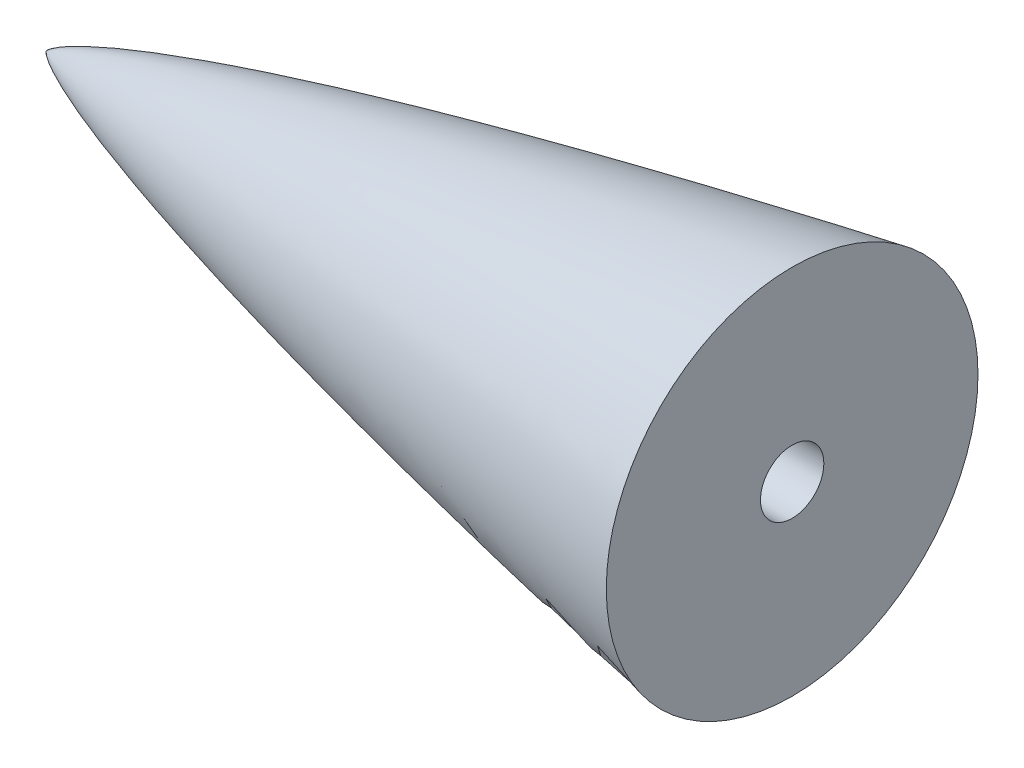
ISO-10303-21;
HEADER;
FILE_DESCRIPTION(('STEP AP214'),'2;1');
FILE_NAME('part.step','',(''),(''),'','','');
FILE_SCHEMA(('AUTOMOTIVE_DESIGN { 1 0 10303 214 1 1 1 1 }'));
ENDSEC;
DATA;
#1=APPLICATION_CONTEXT('core data for automotive mechanical design processes');
#2=APPLICATION_PROTOCOL_DEFINITION('international standard','automotive_design',2000,#1);
#3=PRODUCT_CONTEXT('',#1,'mechanical');
#4=PRODUCT('Part','Part','',(#3));
#5=PRODUCT_RELATED_PRODUCT_CATEGORY('part','',(#4));
#6=PRODUCT_DEFINITION_FORMATION('','',#4);
#7=PRODUCT_DEFINITION_CONTEXT('part definition',#1,'design');
#8=PRODUCT_DEFINITION('design','',#6,#7);
#9=PRODUCT_DEFINITION_SHAPE('','',#8);
#10=(LENGTH_UNIT() NAMED_UNIT(*) SI_UNIT(.MILLI.,.METRE.));
#11=(NAMED_UNIT(*) PLANE_ANGLE_UNIT() SI_UNIT($,.RADIAN.));
#12=(NAMED_UNIT(*) SI_UNIT($,.STERADIAN.) SOLID_ANGLE_UNIT());
#13=UNCERTAINTY_MEASURE_WITH_UNIT(LENGTH_MEASURE(1.E-05),#10,'distance_accuracy_value','');
#14=(GEOMETRIC_REPRESENTATION_CONTEXT(3) GLOBAL_UNCERTAINTY_ASSIGNED_CONTEXT((#13)) GLOBAL_UNIT_ASSIGNED_CONTEXT((#10,
#11,#12)) REPRESENTATION_CONTEXT('',''));
#15=CARTESIAN_POINT('',(0.,0.,0.));
#16=DIRECTION('',(0.,0.,1.));
#17=DIRECTION('',(1.,0.,0.));
#18=AXIS2_PLACEMENT_3D('',#15,#16,#17);
#19=CARTESIAN_POINT('',(80.,0.,0.));
#20=DIRECTION('',(1.,0.,0.));
#21=DIRECTION('',(0.,0.,-1.));
#22=AXIS2_PLACEMENT_3D('',#19,#20,#21);
#23=PLANE('',#22);
#24=CARTESIAN_POINT('',(80.,0.,0.));
#25=DIRECTION('',(1.,0.,0.));
#26=DIRECTION('',(0.,0.,-1.));
#27=AXIS2_PLACEMENT_3D('',#24,#25,#26);
#28=CIRCLE('',#27,3.4);
#29=CARTESIAN_POINT('',(80.,0.,-3.4));
#30=VERTEX_POINT('',#29);
#31=EDGE_CURVE('E79',#30,#30,#28,.T.);
#32=ORIENTED_EDGE('',*,*,#31,.F.);
#33=EDGE_LOOP('',(#32));
#34=FACE_BOUND('',#33,.T.);
#35=CARTESIAN_POINT('',(80.,0.,0.));
#36=DIRECTION('',(-1.,0.,0.));
#37=DIRECTION('',(0.,0.,1.));
#38=AXIS2_PLACEMENT_3D('',#35,#36,#37);
#39=CIRCLE('',#38,19.9360865732292);
#40=CARTESIAN_POINT('',(80.,0.,19.9360865732292));
#41=VERTEX_POINT('',#40);
#42=EDGE_CURVE('E12',#41,#41,#39,.F.);
#43=ORIENTED_EDGE('',*,*,#42,.T.);
#44=EDGE_LOOP('',(#43));
#45=FACE_BOUND('',#44,.T.);
#46=ADVANCED_FACE('F46',(#34,#45),#23,.T.);
#47=CARTESIAN_POINT('',(522.,64.,0.));
#48=CARTESIAN_POINT('',(521.590516942007,64.,0.));
#49=CARTESIAN_POINT('',(520.771561040287,63.9942688934299,0.));
#50=CARTESIAN_POINT('',(519.133691426009,63.9802670014868,0.));
#51=CARTESIAN_POINT('',(516.677010913587,63.9463939524722,0.));
#52=CARTESIAN_POINT('',(513.81106355721,63.8963781150164,0.));
#53=CARTESIAN_POINT('',(508.079596574187,63.7736937527318,0.));
#54=CARTESIAN_POINT('',(502.151121166139,63.6094457906622,0.));
#55=CARTESIAN_POINT('',(496.025715941466,63.409883926183,0.));
#56=CARTESIAN_POINT('',(489.703465178406,63.1762923349364,0.));
#57=CARTESIAN_POINT('',(485.63900431218,63.0166861878967,0.));
#58=CARTESIAN_POINT('',(480.558876848224,62.8060522017456,0.));
#59=CARTESIAN_POINT('',(474.463438705073,62.5365027866264,0.));
#60=CARTESIAN_POINT('',(467.353134193147,62.1993055640769,0.));
#61=CARTESIAN_POINT('',(459.228488268017,61.7852756732708,0.));
#62=CARTESIAN_POINT('',(449.074445036233,61.234348915932,0.));
#63=CARTESIAN_POINT('',(436.892399390841,60.5230064918632,0.));
#64=CARTESIAN_POINT('',(422.684094329235,59.6255360051907,0.));
#65=CARTESIAN_POINT('',(406.451649281317,58.5145436942091,0.));
#66=CARTESIAN_POINT('',(390.224875337688,57.3236348081094,0.));
#67=CARTESIAN_POINT('',(374.003843123209,56.0568670763544,0.));
#68=CARTESIAN_POINT('',(357.788673830139,54.717201132632,0.));
#69=CARTESIAN_POINT('',(337.527208668775,52.9542978334076,0.));
#70=CARTESIAN_POINT('',(313.225812894759,50.7004206895206,0.));
#71=CARTESIAN_POINT('',(284.893049860698,47.8733531730444,0.));
#72=CARTESIAN_POINT('',(252.541063500701,44.3705230861258,0.));
#73=CARTESIAN_POINT('',(220.220524829406,40.5877041843803,0.));
#74=CARTESIAN_POINT('',(187.93626848825,36.5067060471793,0.));
#75=CARTESIAN_POINT('',(155.694792913666,32.0989089346133,0.));
#76=CARTESIAN_POINT('',(123.506939436542,27.3147890527032,0.));
#77=CARTESIAN_POINT('',(91.3889285154668,22.077714796997,0.));
#78=CARTESIAN_POINT('',(62.8439543785186,16.872422149387,0.));
#79=CARTESIAN_POINT('',(39.4821084234338,12.0345623327772,0.));
#80=CARTESIAN_POINT('',(22.6082275835392,7.96176973354541,0.));
#81=CARTESIAN_POINT('',(12.8800296426853,5.24028530882847,0.));
#82=CARTESIAN_POINT('',(7.19313976770063,3.38812297662853,0.));
#83=CARTESIAN_POINT('',(4.12322816040121,2.23009214067667,0.));
#84=CARTESIAN_POINT('',(2.46511193855896,1.51464459715414,0.));
#85=CARTESIAN_POINT('',(1.534590026526,1.06017013162303,0.));
#86=CARTESIAN_POINT('',(0.982994633851909,0.758855245518446,0.));
#87=CARTESIAN_POINT('',(0.660423816631462,0.562634850320563,0.));
#88=CARTESIAN_POINT('',(0.460446691137349,0.428551795033052,0.));
#89=CARTESIAN_POINT('',(0.333600700303157,0.33590032232443,0.));
#90=CARTESIAN_POINT('',(0.253680330401727,0.273933255901504,0.));
#91=CARTESIAN_POINT('',(0.184725886275937,0.216219225073717,0.));
#92=CARTESIAN_POINT('',(0.126589164605975,0.163112600127914,0.));
#93=CARTESIAN_POINT('',(0.0792582841063476,0.115021795232016,0.));
#94=CARTESIAN_POINT('',(0.0466617169851801,0.0779953229370678,0.));
#95=CARTESIAN_POINT('',(0.0215064173775888,0.0441662632204878,0.));
#96=CARTESIAN_POINT('',(0.00677148560998358,0.0199364911642674,0.));
#97=CARTESIAN_POINT('',(0.00182695339847098,0.00681618098661998,0.));
#98=CARTESIAN_POINT('',(0.,0.,0.));
#99=B_SPLINE_CURVE_WITH_KNOTS('',4,(#47,#48,#49,#50,#51,#52,#53,#54,#55,#56,#57,#58,#59,#60,#61,
#62,#63,#64,#65,#66,#67,#68,#69,#70,#71,#72,#73,#74,#75,#76,#77,#78,#79,#80,#81,#82,#83,#84,#85,
#86,#87,#88,#89,#90,#91,#92,#93,#94,#95,#96,#97,#98),.UNSPECIFIED.,.F.,.F.,(5,1,1,1,1,1,1,1,1,1,
1,1,1,1,1,1,1,1,1,1,1,1,1,1,1,1,1,1,1,1,1,1,1,1,1,1,1,1,1,1,1,1,1,1,1,1,1,1,5),(0.,
0.00310644739088894,0.00621289478177789,0.0124257895635557,0.0186386843453334,
0.0248515791271113,0.0497031582542228,0.0574176140747542,0.0651320698952855,0.0728465257158168,
0.0805609815363483,0.095989893177411,0.111418804818474,0.12684768666646,0.142276568514445,
0.173134332210417,0.20399214040648,0.234849948602543,0.265707766276664,0.296565583950786,
0.327423428677223,0.358281273403661,0.419996827228449,0.481712432966205,0.543428043582617,
0.605143624865866,0.666859247489944,0.72857493688404,0.790290361928457,0.852005914200549,
0.913721421920756,0.948680452149767,0.971252136817206,0.983668328658008,0.990336505939893,
0.99403931307382,0.996134647532728,0.997363630870977,0.998189895614069,0.998806063777457,
0.998997830505255,0.999189597233053,0.999381363960851,0.999573130688649,0.999679848016487,
0.999786565344324,0.999893282672162,0.999946641336081,1.),.UNSPECIFIED.);
#100=CARTESIAN_POINT('',(-5.18625797548872,0.,0.));
#101=DIRECTION('',(-1.,0.,0.));
#102=AXIS1_PLACEMENT('',#100,#101);
#103=SURFACE_OF_REVOLUTION('',#99,#102);
#104=CARTESIAN_POINT('',(0.,0.,0.));
#105=VERTEX_POINT('',#104);
#106=VERTEX_LOOP('',#105);
#107=FACE_BOUND('',#106,.T.);
#108=ORIENTED_EDGE('',*,*,#42,.F.);
#109=EDGE_LOOP('',(#108));
#110=FACE_BOUND('',#109,.T.);
#111=ADVANCED_FACE('F48',(#107,#110),#103,.T.);
#112=CARTESIAN_POINT('',(40.,0.,0.));
#113=DIRECTION('',(1.,0.,0.));
#114=DIRECTION('',(0.,0.,-1.));
#115=AXIS2_PLACEMENT_3D('',#112,#113,#114);
#116=CYLINDRICAL_SURFACE('',#115,3.4);
#117=CARTESIAN_POINT('',(40.,0.,0.));
#118=DIRECTION('',(1.,0.,0.));
#119=DIRECTION('',(0.,0.,-1.));
#120=AXIS2_PLACEMENT_3D('',#117,#118,#119);
#121=CIRCLE('',#120,3.4);
#122=CARTESIAN_POINT('',(40.,0.,-3.4));
#123=VERTEX_POINT('',#122);
#124=EDGE_CURVE('E53',#123,#123,#121,.T.);
#125=ORIENTED_EDGE('',*,*,#124,.F.);
#126=EDGE_LOOP('',(#125));
#127=FACE_BOUND('',#126,.T.);
#128=ORIENTED_EDGE('',*,*,#31,.T.);
#129=EDGE_LOOP('',(#128));
#130=FACE_BOUND('',#129,.T.);
#131=ADVANCED_FACE('F58',(#127,#130),#116,.F.);
#132=CARTESIAN_POINT('',(40.,0.,0.));
#133=DIRECTION('',(1.,0.,0.));
#134=DIRECTION('',(0.,0.,-1.));
#135=AXIS2_PLACEMENT_3D('',#132,#133,#134);
#136=PLANE('',#135);
#137=ORIENTED_EDGE('',*,*,#124,.T.);
#138=EDGE_LOOP('',(#137));
#139=FACE_BOUND('',#138,.T.);
#140=ADVANCED_FACE('F70',(#139),#136,.T.);
#141=CLOSED_SHELL('',(#46,#111,#131,#140));
#142=MANIFOLD_SOLID_BREP('B2',#141);
#143=ADVANCED_BREP_SHAPE_REPRESENTATION('',(#18,#142),#14);
#144=SHAPE_DEFINITION_REPRESENTATION(#9,#143);
ENDSEC;
END-ISO-10303-21;
